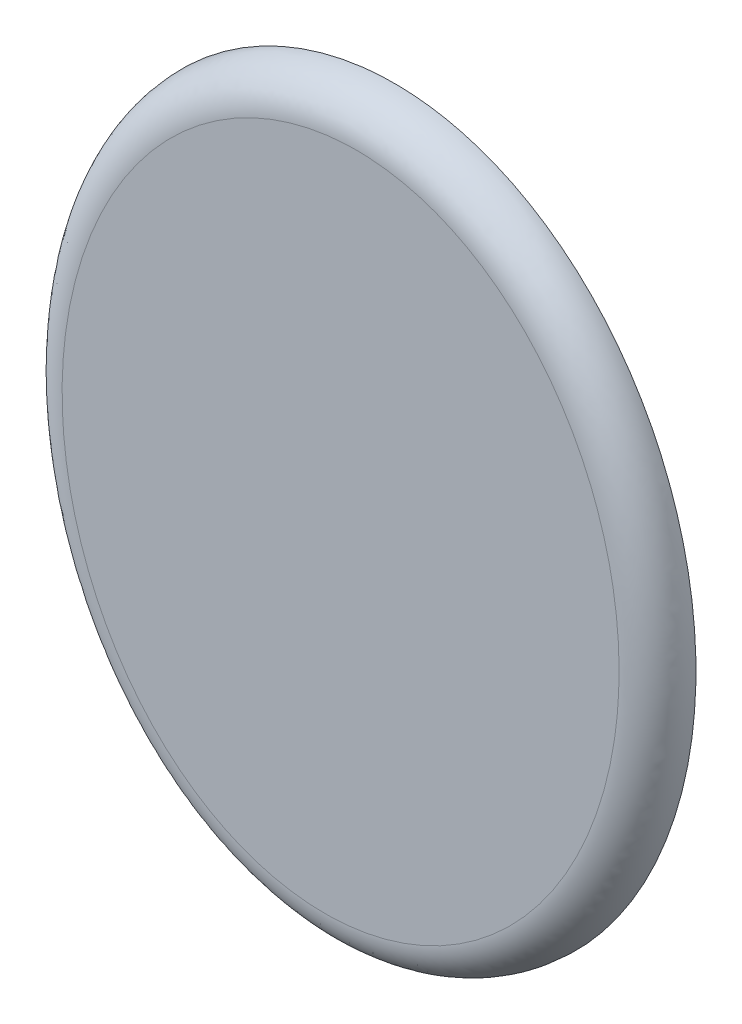
ISO-10303-21;
HEADER;
FILE_DESCRIPTION(('STEP AP214'),'2;1');
FILE_NAME('part.step','',(''),(''),'','','');
FILE_SCHEMA(('AUTOMOTIVE_DESIGN { 1 0 10303 214 1 1 1 1 }'));
ENDSEC;
DATA;
#1=APPLICATION_CONTEXT('core data for automotive mechanical design processes');
#2=APPLICATION_PROTOCOL_DEFINITION('international standard','automotive_design',2000,#1);
#3=PRODUCT_CONTEXT('',#1,'mechanical');
#4=PRODUCT('Part','Part','',(#3));
#5=PRODUCT_RELATED_PRODUCT_CATEGORY('part','',(#4));
#6=PRODUCT_DEFINITION_FORMATION('','',#4);
#7=PRODUCT_DEFINITION_CONTEXT('part definition',#1,'design');
#8=PRODUCT_DEFINITION('design','',#6,#7);
#9=PRODUCT_DEFINITION_SHAPE('','',#8);
#10=(LENGTH_UNIT() NAMED_UNIT(*) SI_UNIT(.MILLI.,.METRE.));
#11=(NAMED_UNIT(*) PLANE_ANGLE_UNIT() SI_UNIT($,.RADIAN.));
#12=(NAMED_UNIT(*) SI_UNIT($,.STERADIAN.) SOLID_ANGLE_UNIT());
#13=UNCERTAINTY_MEASURE_WITH_UNIT(LENGTH_MEASURE(1.E-05),#10,'distance_accuracy_value','');
#14=(GEOMETRIC_REPRESENTATION_CONTEXT(3) GLOBAL_UNCERTAINTY_ASSIGNED_CONTEXT((#13)) GLOBAL_UNIT_ASSIGNED_CONTEXT((#10,
#11,#12)) REPRESENTATION_CONTEXT('',''));
#15=CARTESIAN_POINT('',(0.,0.,0.));
#16=DIRECTION('',(0.,0.,1.));
#17=DIRECTION('',(1.,0.,0.));
#18=AXIS2_PLACEMENT_3D('',#15,#16,#17);
#19=CARTESIAN_POINT('',(0.,0.,2.54));
#20=DIRECTION('',(0.,0.,1.));
#21=DIRECTION('',(1.,0.,0.));
#22=AXIS2_PLACEMENT_3D('',#19,#20,#21);
#23=PLANE('',#22);
#24=CARTESIAN_POINT('',(0.391640197155069,22.353520657387,2.54));
#25=CARTESIAN_POINT('',(0.284177639284905,24.8912463712214,2.54));
#26=CARTESIAN_POINT('',(0.284177639284905,24.8912463712214,0.));
#27=CARTESIAN_POINT('',(0.846379474677865,22.3727809826161,2.54));
#28=CARTESIAN_POINT('',(0.815227843471181,24.9137391399928,2.54));
#29=CARTESIAN_POINT('',(0.815227843471181,24.9137391399928,0.));
#30=CARTESIAN_POINT('',(1.30195747029851,22.3714955758664,2.54));
#31=CARTESIAN_POINT('',(1.34791345861704,24.9122586019739,2.54));
#32=CARTESIAN_POINT('',(1.34791345861704,24.9122586019739,0.));
#33=CARTESIAN_POINT('',(2.21107770155789,22.3273327193164,2.54));
#34=CARTESIAN_POINT('',(2.41157310757733,24.8605879934345,2.54));
#35=CARTESIAN_POINT('',(2.41157310757733,24.8605879934345,0.));
#36=CARTESIAN_POINT('',(2.66462015157246,22.2844597577711,2.54));
#37=CARTESIAN_POINT('',(2.94254731988724,24.8104031792269,2.54));
#38=CARTESIAN_POINT('',(2.94254731988724,24.8104031792269,0.));
#39=CARTESIAN_POINT('',(3.56569066038427,22.157331481397,2.54));
#40=CARTESIAN_POINT('',(3.99743304121653,24.6615738548264,2.54));
#41=CARTESIAN_POINT('',(3.99743304121653,24.6615738548264,0.));
#42=CARTESIAN_POINT('',(4.01322084331342,22.0730911988978,2.54));
#43=CARTESIAN_POINT('',(4.52134704481903,24.5629469478377,2.54));
#44=CARTESIAN_POINT('',(4.52134704481903,24.5629469478377,0.));
#45=CARTESIAN_POINT('',(4.89871978981839,21.8641356197771,2.54));
#46=CARTESIAN_POINT('',(5.55729447685476,24.3184895181597,2.54));
#47=CARTESIAN_POINT('',(5.55729447685476,24.3184895181597,0.));
#48=CARTESIAN_POINT('',(5.3366887677903,21.7394212317253,2.54));
#49=CARTESIAN_POINT('',(6.06932817170281,24.1726600550819,2.54));
#50=CARTESIAN_POINT('',(6.06932817170281,24.1726600550819,0.));
#51=CARTESIAN_POINT('',(6.1665561264388,21.4621319603144,2.54));
#52=CARTESIAN_POINT('',(7.0383261415553,23.8488831562864,2.54));
#53=CARTESIAN_POINT('',(7.0383261415553,23.8488831562864,0.));
#54=CARTESIAN_POINT('',(6.55941549426075,21.3124189585122,2.54));
#55=CARTESIAN_POINT('',(7.49650633388856,23.6742469805276,2.54));
#56=CARTESIAN_POINT('',(7.49650633388857,23.6742469805276,0.));
#57=CARTESIAN_POINT('',(7.33158315630487,20.9814794043709,2.54));
#58=CARTESIAN_POINT('',(8.39565011517977,23.2888876652429,2.54));
#59=CARTESIAN_POINT('',(8.39565011517977,23.2888876652429,0.));
#60=CARTESIAN_POINT('',(7.71089238782342,20.8002550368588,2.54));
#61=CARTESIAN_POINT('',(8.83661489516698,23.0781670276329,2.54));
#62=CARTESIAN_POINT('',(8.83661489516698,23.0781670276329,0.));
#63=CARTESIAN_POINT('',(8.45383955157926,20.4082622416998,2.54));
#64=CARTESIAN_POINT('',(9.69868988839443,22.6233208039314,2.54));
#65=CARTESIAN_POINT('',(9.69868988839443,22.6233208039314,0.));
#66=CARTESIAN_POINT('',(8.81747929096305,20.1974972329321,2.54));
#67=CARTESIAN_POINT('',(10.119802391707,22.379199083584,2.54));
#68=CARTESIAN_POINT('',(10.119802391707,22.379199083584,0.));
#69=CARTESIAN_POINT('',(9.5275296036619,19.7484871027649,2.54));
#70=CARTESIAN_POINT('',(10.9403318292393,21.8603262690566,2.54));
#71=CARTESIAN_POINT('',(10.9403318292393,21.8603262690566,0.));
#72=CARTESIAN_POINT('',(9.87393354508376,19.51023151895,2.54));
#73=CARTESIAN_POINT('',(11.339740417712,21.585563514795,2.54));
#74=CARTESIAN_POINT('',(11.339740417712,21.585563514795,0.));
#75=CARTESIAN_POINT('',(10.567424713038,18.9940914425591,2.54));
#76=CARTESIAN_POINT('',(12.137541389846,20.9917904492521,2.54));
#77=CARTESIAN_POINT('',(12.137541389846,20.9917904492521,0.));
#78=CARTESIAN_POINT('',(10.9134017500032,18.7147147184357,2.54));
#79=CARTESIAN_POINT('',(12.5345497845532,20.6711429915601,2.54));
#80=CARTESIAN_POINT('',(12.5345497845532,20.6711429915601,0.));
#81=CARTESIAN_POINT('',(11.5832146844287,18.1304938228064,2.54));
#82=CARTESIAN_POINT('',(13.3012888235293,20.0023804892595,2.54));
#83=CARTESIAN_POINT('',(13.3012888235293,20.0023804892595,0.));
#84=CARTESIAN_POINT('',(11.9070425373774,17.8256404866575,2.54));
#85=CARTESIAN_POINT('',(13.6710095608243,19.6542555627666,2.54));
#86=CARTESIAN_POINT('',(13.6710095608243,19.6542555627666,0.));
#87=CARTESIAN_POINT('',(12.8438093304033,16.8769088843263,2.54));
#88=CARTESIAN_POINT('',(14.7379455561792,18.5737009540554,2.54));
#89=CARTESIAN_POINT('',(14.7379455561792,18.5737009540554,0.));
#90=CARTESIAN_POINT('',(13.422357173862,16.1986132115718,2.54));
#91=CARTESIAN_POINT('',(15.39330877465,17.8048081550136,2.54));
#92=CARTESIAN_POINT('',(15.39330877465,17.8048081550136,0.));
#93=CARTESIAN_POINT('',(14.5617836366818,14.6651328560788,2.54));
#94=CARTESIAN_POINT('',(16.6785872063486,16.0750539029568,2.54));
#95=CARTESIAN_POINT('',(16.6785872063486,16.0750539029568,0.));
#96=CARTESIAN_POINT('',(15.1073018675721,13.7986352866231,2.54));
#97=CARTESIAN_POINT('',(17.2902964455484,15.1026367483074,2.54));
#98=CARTESIAN_POINT('',(17.2902964455484,15.1026367483074,0.));
#99=CARTESIAN_POINT('',(16.0712886609084,11.9977376925059,2.54));
#100=CARTESIAN_POINT('',(18.367080885641,13.0909989967687,2.54));
#101=CARTESIAN_POINT('',(18.367080885641,13.0909989967687,0.));
#102=CARTESIAN_POINT('',(16.489680844033,11.0632972628485,2.54));
#103=CARTESIAN_POINT('',(18.8320679399781,12.0517386919722,2.54));
#104=CARTESIAN_POINT('',(18.8320679399781,12.0517386919722,0.));
#105=CARTESIAN_POINT('',(17.267121593467,8.97138401549319,2.54));
#106=CARTESIAN_POINT('',(19.693618263704,9.73353407481541,2.54));
#107=CARTESIAN_POINT('',(19.693618263704,9.73353407481541,0.));
#108=CARTESIAN_POINT('',(17.6010002594183,7.80455825210883,2.54));
#109=CARTESIAN_POINT('',(20.0617528432848,8.44573050640986,2.54));
#110=CARTESIAN_POINT('',(20.0617528432848,8.44573050640986,0.));
#111=CARTESIAN_POINT('',(18.0987366580579,5.43530738129285,2.54));
#112=CARTESIAN_POINT('',(20.6094927913668,5.83840571361696,2.54));
#113=CARTESIAN_POINT('',(20.6094927913668,5.83840571361696,0.));
#114=CARTESIAN_POINT('',(18.2624952530707,4.23286193572752,2.54));
#115=CARTESIAN_POINT('',(20.7889882308911,4.51886645292546,2.54));
#116=CARTESIAN_POINT('',(20.7889882308911,4.51886645292546,0.));
#117=CARTESIAN_POINT('',(18.4384725245585,1.61838347496086,2.54));
#118=CARTESIAN_POINT('',(20.9817877668304,1.65457713463331,2.54));
#119=CARTESIAN_POINT('',(20.9817877668304,1.65457713463331,0.));
#120=CARTESIAN_POINT('',(18.4213941869948,0.204355142710669,2.54));
#121=CARTESIAN_POINT('',(20.9629648946311,0.108423351618026,2.54));
#122=CARTESIAN_POINT('',(20.9629648946311,0.108423351618026,0.));
#123=CARTESIAN_POINT('',(18.1697916399954,-2.6057095879929,2.54));
#124=CARTESIAN_POINT('',(20.6879759626174,-2.96285509598669,2.54));
#125=CARTESIAN_POINT('',(20.6879759626174,-2.96285509598669,0.));
#126=CARTESIAN_POINT('',(17.9350841540455,-4.00172981607571,2.54));
#127=CARTESIAN_POINT('',(20.4316098557586,-4.48796093623728,2.54));
#128=CARTESIAN_POINT('',(20.4316098557586,-4.48796093623727,0.));
#129=CARTESIAN_POINT('',(17.4089714730622,-6.11278152929581,2.54));
#130=CARTESIAN_POINT('',(19.8562612908344,-6.79649857089184,2.54));
#131=CARTESIAN_POINT('',(19.8562612908344,-6.79649857089184,0.));
#132=CARTESIAN_POINT('',(17.1925936468142,-6.84725214258196,2.54));
#133=CARTESIAN_POINT('',(19.6195437024275,-7.60012254220796,2.54));
#134=CARTESIAN_POINT('',(19.6195437024275,-7.60012254220796,0.));
#135=CARTESIAN_POINT('',(16.6974744942983,-8.29520270451191,2.54));
#136=CARTESIAN_POINT('',(19.0772844774508,-9.18594355197769,2.54));
#137=CARTESIAN_POINT('',(19.0772844774507,-9.18594355197769,0.));
#138=CARTESIAN_POINT('',(16.4187247824864,-9.00867981609144,2.54));
#139=CARTESIAN_POINT('',(18.7717335865988,-9.96813769342652,2.54));
#140=CARTESIAN_POINT('',(18.7717335865987,-9.96813769342652,0.));
#141=CARTESIAN_POINT('',(15.7995106255763,-10.4078399436349,2.54));
#142=CARTESIAN_POINT('',(18.0919134357411,-11.5042397792471,2.54));
#143=CARTESIAN_POINT('',(18.0919134357411,-11.5042397792471,0.));
#144=CARTESIAN_POINT('',(15.459082007902,-11.0935388136911,2.54));
#145=CARTESIAN_POINT('',(17.717684067379,-12.2581638396086,2.54));
#146=CARTESIAN_POINT('',(17.7176840673791,-12.2581638396086,0.));
#147=CARTESIAN_POINT('',(14.7168806220005,-12.4308667453243,2.54));
#148=CARTESIAN_POINT('',(16.9000888928045,-13.7313423237128,2.54));
#149=CARTESIAN_POINT('',(16.9000888928045,-13.7313423237128,0.));
#150=CARTESIAN_POINT('',(14.3151230153396,-13.0825041741642,2.54));
#151=CARTESIAN_POINT('',(16.4567401734926,-14.4506052586102,2.54));
#152=CARTESIAN_POINT('',(16.4567401734926,-14.4506052586102,0.));
#153=CARTESIAN_POINT('',(13.5457924395887,-14.205845575938,2.54));
#154=CARTESIAN_POINT('',(15.6055414390909,-15.6934830661455,2.54));
#155=CARTESIAN_POINT('',(15.6055414390909,-15.6934830661455,0.));
#156=CARTESIAN_POINT('',(13.1900381936044,-14.6856746429925,2.54));
#157=CARTESIAN_POINT('',(15.2112214642633,-16.2254175669651,2.54));
#158=CARTESIAN_POINT('',(15.2112214642633,-16.2254175669651,0.));
#159=CARTESIAN_POINT('',(12.4420966022632,-15.6160987591055,2.54));
#160=CARTESIAN_POINT('',(14.3802512867556,-17.2591286760381,2.54));
#161=CARTESIAN_POINT('',(14.3802512867556,-17.2591286760381,0.));
#162=CARTESIAN_POINT('',(12.0499122157169,-16.0666961772822,2.54));
#163=CARTESIAN_POINT('',(13.9436045216793,-17.7609077280371,2.54));
#164=CARTESIAN_POINT('',(13.9436045216793,-17.7609077280371,0.));
#165=CARTESIAN_POINT('',(11.2303903532335,-16.9338036527581,2.54));
#166=CARTESIAN_POINT('',(13.0287272934503,-18.7289072284042,2.54));
#167=CARTESIAN_POINT('',(13.0287272934503,-18.7289072284042,0.));
#168=CARTESIAN_POINT('',(10.8030931055884,-17.3503516575552,2.54));
#169=CARTESIAN_POINT('',(12.5505443827705,-19.1951672215908,2.54));
#170=CARTESIAN_POINT('',(12.5505443827705,-19.1951672215908,0.));
#171=CARTESIAN_POINT('',(9.9142462941174,-18.1450979814349,2.54));
#172=CARTESIAN_POINT('',(11.552870343445,-20.0872196870253,2.54));
#173=CARTESIAN_POINT('',(11.552870343445,-20.0872196870253,0.));
#174=CARTESIAN_POINT('',(9.45270501542419,-18.5233055246947,2.54));
#175=CARTESIAN_POINT('',(11.0333892044913,-20.5130218912958,2.54));
#176=CARTESIAN_POINT('',(11.0333892044913,-20.5130218912958,0.));
#177=CARTESIAN_POINT('',(8.57839518515418,-19.175660658582,2.54));
#178=CARTESIAN_POINT('',(10.0461142702822,-21.2496629755941,2.54));
#179=CARTESIAN_POINT('',(10.0461142702822,-21.2496629755941,0.));
#180=CARTESIAN_POINT('',(8.17066360099923,-19.4565705569593,2.54));
#181=CARTESIAN_POINT('',(9.58453483459261,-21.5677427490576,2.54));
#182=CARTESIAN_POINT('',(9.58453483459261,-21.5677427490576,0.));
#183=CARTESIAN_POINT('',(7.33447206578364,-19.9852115955385,2.54));
#184=CARTESIAN_POINT('',(8.63523844073702,-22.1678888019102,2.54));
#185=CARTESIAN_POINT('',(8.63523844073702,-22.1678888019102,0.));
#186=CARTESIAN_POINT('',(6.9060237922958,-20.2329611374949,2.54));
#187=CARTESIAN_POINT('',(8.14753619113725,-22.4499750511783,2.54));
#188=CARTESIAN_POINT('',(8.14753619113725,-22.4499750511783,0.));
#189=CARTESIAN_POINT('',(6.02977197421466,-20.6924093820414,2.54));
#190=CARTESIAN_POINT('',(7.14722458354756,-22.9744713835053,2.54));
#191=CARTESIAN_POINT('',(7.14722458354756,-22.9744713835053,0.));
#192=CARTESIAN_POINT('',(5.58195478606403,-20.9040821358383,2.54));
#193=CARTESIAN_POINT('',(6.63459763585286,-23.2168529034871,2.54));
#194=CARTESIAN_POINT('',(6.63459763585286,-23.2168529034871,0.));
#195=CARTESIAN_POINT('',(4.66966949681388,-21.2879601059054,2.54));
#196=CARTESIAN_POINT('',(5.58731258201675,-23.6575363282305,2.54));
#197=CARTESIAN_POINT('',(5.58731258201675,-23.6575363282305,0.));
#198=CARTESIAN_POINT('',(4.20520186037581,-21.4601664225692,2.54));
#199=CARTESIAN_POINT('',(5.05265509061615,-23.8558394619704,2.54));
#200=CARTESIAN_POINT('',(5.05265509061615,-23.8558394619704,0.));
#201=CARTESIAN_POINT('',(3.25875317221698,-21.7633082278554,2.54));
#202=CARTESIAN_POINT('',(3.960266898935,-24.2057238299958,2.54));
#203=CARTESIAN_POINT('',(3.960266898935,-24.2057238299958,0.));
#204=CARTESIAN_POINT('',(2.77666020843539,-21.893895793036,2.54));
#205=CARTESIAN_POINT('',(3.4023836236573,-24.3569109641507,2.54));
#206=CARTESIAN_POINT('',(3.4023836236573,-24.3569109641507,0.));
#207=CARTESIAN_POINT('',(1.80216595778287,-22.1091237985066,2.54));
#208=CARTESIAN_POINT('',(2.27201986367654,-24.6065632771048,2.54));
#209=CARTESIAN_POINT('',(2.27201986367654,-24.6065632771048,0.));
#210=CARTESIAN_POINT('',(1.30976266388863,-22.1937552049057,2.54));
#211=CARTESIAN_POINT('',(1.69953653208832,-24.7050180899282,2.54));
#212=CARTESIAN_POINT('',(1.69953653208832,-24.7050180899282,0.));
#213=CARTESIAN_POINT('',(0.320588917871295,-22.3146517261667,2.54));
#214=CARTESIAN_POINT('',(0.547341550102333,-24.8458381610729,2.54));
#215=CARTESIAN_POINT('',(0.547341550102333,-24.8458381610729,0.));
#216=CARTESIAN_POINT('',(-0.176163394645175,-22.3510651202879,2.54));
#217=CARTESIAN_POINT('',(-0.032342380654814,-24.8883753733572,2.54));
#218=CARTESIAN_POINT('',(-0.0323423806548137,-24.8883753733572,0.));
#219=CARTESIAN_POINT('',(-1.17056143836497,-22.3745756827744,2.54));
#220=CARTESIAN_POINT('',(-1.19417258112527,-24.9158429479039,2.54));
#221=CARTESIAN_POINT('',(-1.19417258112527,-24.9158429479039,0.));
#222=CARTESIAN_POINT('',(-1.66820603285543,-22.3617152636274,2.54));
#223=CARTESIAN_POINT('',(-1.77631630256362,-24.900822852679,2.54));
#224=CARTESIAN_POINT('',(-1.77631630256362,-24.9008228526789,0.));
#225=CARTESIAN_POINT('',(-2.31639472745618,-22.3124510853269,2.54));
#226=CARTESIAN_POINT('',(-2.53492977398452,-24.843167683844,2.54));
#227=CARTESIAN_POINT('',(-2.53492977398452,-24.843167683844,0.));
#228=CARTESIAN_POINT('',(-2.46885848707325,-22.2984940544918,2.54));
#229=CARTESIAN_POINT('',(-2.71339359946976,-24.8268304792632,2.54));
#230=CARTESIAN_POINT('',(-2.71339359946976,-24.8268304792632,0.));
#231=CARTESIAN_POINT('',(-2.77328341481524,-22.2658875106034,2.54));
#232=CARTESIAN_POINT('',(-3.06975911552851,-24.788660597623,2.54));
#233=CARTESIAN_POINT('',(-3.06975911552851,-24.788660597623,0.));
#234=CARTESIAN_POINT('',(-2.92524458936755,-22.2472380577967,2.54));
#235=CARTESIAN_POINT('',(-3.24766081328955,-24.7668279911198,2.54));
#236=CARTESIAN_POINT('',(-3.24766081328955,-24.7668279911198,0.));
#237=CARTESIAN_POINT('',(-3.50882127723457,-22.1664448460176,2.54));
#238=CARTESIAN_POINT('',(-3.93085636653116,-24.6722420008777,2.54));
#239=CARTESIAN_POINT('',(-3.93085636653116,-24.6722420008777,0.));
#240=CARTESIAN_POINT('',(-3.93825945356189,-22.0876148137101,2.54));
#241=CARTESIAN_POINT('',(-4.43360017124716,-24.579949262195,2.54));
#242=CARTESIAN_POINT('',(-4.43360017124716,-24.579949262195,0.));
#243=CARTESIAN_POINT('',(-4.78877354607199,-21.8926258631644,2.54));
#244=CARTESIAN_POINT('',(-5.42870751298194,-24.3518115245675,2.54));
#245=CARTESIAN_POINT('',(-5.42870751298195,-24.3518115245675,0.));
#246=CARTESIAN_POINT('',(-5.20984391987412,-21.7764430255926,2.54));
#247=CARTESIAN_POINT('',(-5.92106418260101,-24.2159386186523,2.54));
#248=CARTESIAN_POINT('',(-5.92106418260101,-24.2159386186523,0.));
#249=CARTESIAN_POINT('',(-6.04132456518352,-21.5077719452138,2.54));
#250=CARTESIAN_POINT('',(-6.89220687552782,-23.9021397739115,2.54));
#251=CARTESIAN_POINT('',(-6.89220687552782,-23.9021397739115,0.));
#252=CARTESIAN_POINT('',(-6.45170777542214,-21.3551999192969,2.54));
#253=CARTESIAN_POINT('',(-7.37095868510686,-23.7241167950075,2.54));
#254=CARTESIAN_POINT('',(-7.37095868510686,-23.7241167950075,0.));
#255=CARTESIAN_POINT('',(-7.25792231859373,-21.0157458491258,2.54));
#256=CARTESIAN_POINT('',(-8.30997867095168,-23.3287460677262,2.54));
#257=CARTESIAN_POINT('',(-8.30997867095167,-23.3287460677262,0.));
#258=CARTESIAN_POINT('',(-7.65375589128512,-20.8288691124823,2.54));
#259=CARTESIAN_POINT('',(-8.77024969314974,-23.1114044027952,2.54));
#260=CARTESIAN_POINT('',(-8.77024969314974,-23.1114044027952,0.));
#261=CARTESIAN_POINT('',(-8.42673454944222,-20.4239338990987,2.54));
#262=CARTESIAN_POINT('',(-9.66729881885594,-22.6414738681765,2.54));
#263=CARTESIAN_POINT('',(-9.66729881885594,-22.6414738681765,0.));
#264=CARTESIAN_POINT('',(-8.80395872743807,-20.2060261059729,2.54));
#265=CARTESIAN_POINT('',(-10.1041771724682,-22.3890554629329,2.54));
#266=CARTESIAN_POINT('',(-10.1041771724682,-22.3890554629329,0.));
#267=CARTESIAN_POINT('',(-9.53976977384839,-19.7407678751502,2.54));
#268=CARTESIAN_POINT('',(-10.9544774336248,-21.8514055110485,2.54));
#269=CARTESIAN_POINT('',(-10.9544774336248,-21.8514055110485,0.));
#270=CARTESIAN_POINT('',(-9.89835603068892,-19.4934164721829,2.54));
#271=CARTESIAN_POINT('',(-11.3678985714983,-21.5661728886466,2.54));
#272=CARTESIAN_POINT('',(-11.3678985714983,-21.5661728886466,0.));
#273=CARTESIAN_POINT('',(-10.5951467029795,-18.9719505785291,2.54));
#274=CARTESIAN_POINT('',(-12.1693641748357,-20.9663706993105,2.54));
#275=CARTESIAN_POINT('',(-12.1693641748357,-20.9663706993105,0.));
#276=CARTESIAN_POINT('',(-10.9333628449719,-18.6978517284661,2.54));
#277=CARTESIAN_POINT('',(-12.5574232517456,-20.65181828195,2.54));
#278=CARTESIAN_POINT('',(-12.5574232517456,-20.65181828195,0.));
#279=CARTESIAN_POINT('',(-11.5886074001477,-18.1252207127666,2.54));
#280=CARTESIAN_POINT('',(-13.3074370289785,-19.9963667342634,2.54));
#281=CARTESIAN_POINT('',(-13.3074370289785,-19.9963667342634,0.));
#282=CARTESIAN_POINT('',(-11.9056276751339,-17.8266792591008,2.54));
#283=CARTESIAN_POINT('',(-13.6693817067963,-19.6554575913205,2.54));
#284=CARTESIAN_POINT('',(-13.6693817067963,-19.6554575913205,0.));
#285=CARTESIAN_POINT('',(-12.5441807919211,-17.1807820855722,2.54));
#286=CARTESIAN_POINT('',(-14.396699232919,-18.9197763535442,2.54));
#287=CARTESIAN_POINT('',(-14.396699232919,-18.9197763535442,0.));
#288=CARTESIAN_POINT('',(-12.8637050492393,-16.831439287222,2.54));
#289=CARTESIAN_POINT('',(-14.759628831255,-18.5228987013851,2.54));
#290=CARTESIAN_POINT('',(-14.759628831255,-18.5228987013852,0.));
#291=CARTESIAN_POINT('',(-13.4759795820412,-16.1099564861472,2.54));
#292=CARTESIAN_POINT('',(-15.453362341706,-17.7054251871128,2.54));
#293=CARTESIAN_POINT('',(-15.453362341706,-17.7054251871128,0.));
#294=CARTESIAN_POINT('',(-13.7687201231513,-15.7378082763462,2.54));
#295=CARTESIAN_POINT('',(-15.7841545763784,-17.2848207907377,2.54));
#296=CARTESIAN_POINT('',(-15.7841545763784,-17.2848207907377,0.));
#297=CARTESIAN_POINT('',(-14.6061268901223,-14.5914913813013,2.54));
#298=CARTESIAN_POINT('',(-16.728219754719,-15.9925148982169,2.54));
#299=CARTESIAN_POINT('',(-16.728219754719,-15.9925148982169,0.));
#300=CARTESIAN_POINT('',(-15.1101724876582,-13.7872511487945,2.54));
#301=CARTESIAN_POINT('',(-17.2934019240357,-15.0900935646777,2.54));
#302=CARTESIAN_POINT('',(-17.2934019240357,-15.0900935646777,0.));
#303=CARTESIAN_POINT('',(-16.0873807904737,-11.9743350542776,2.54));
#304=CARTESIAN_POINT('',(-18.3851680726294,-13.0646657518371,2.54));
#305=CARTESIAN_POINT('',(-18.3851680726294,-13.0646657518371,0.));
#306=CARTESIAN_POINT('',(-16.5396925417036,-10.9545165515903,2.54));
#307=CARTESIAN_POINT('',(-18.8876772016246,-11.9306981460108,2.54));
#308=CARTESIAN_POINT('',(-18.8876772016246,-11.9306981460108,0.));
#309=CARTESIAN_POINT('',(-17.2963976068262,-8.86141442451057,2.54));
#310=CARTESIAN_POINT('',(-19.7258346205139,-9.61226558417171,2.54));
#311=CARTESIAN_POINT('',(-19.7258346205139,-9.61226558417171,0.));
#312=CARTESIAN_POINT('',(-17.6006972864052,-7.78809742832458,2.54));
#313=CARTESIAN_POINT('',(-20.061377288389,-8.4277691769455,2.54));
#314=CARTESIAN_POINT('',(-20.061377288389,-8.4277691769455,0.));
#315=CARTESIAN_POINT('',(-18.1075305618271,-5.41323805516549,2.54));
#316=CARTESIAN_POINT('',(-20.6192166996477,-5.8139486309914,2.54));
#317=CARTESIAN_POINT('',(-20.6192166996477,-5.8139486309914,0.));
#318=CARTESIAN_POINT('',(-18.2815834977346,-4.10561945343507,2.54));
#319=CARTESIAN_POINT('',(-20.8099215046607,-4.37919585161958,2.54));
#320=CARTESIAN_POINT('',(-20.8099215046607,-4.37919585161958,0.));
#321=CARTESIAN_POINT('',(-18.4353201195336,-1.47841164549498,2.54));
#322=CARTESIAN_POINT('',(-20.9783090925781,-1.50155506873648,2.54));
#323=CARTESIAN_POINT('',(-20.9783090925781,-1.50155506873648,0.));
#324=CARTESIAN_POINT('',(-18.4148944847277,-0.158816123178907,2.54));
#325=CARTESIAN_POINT('',(-20.9558720637691,-0.0586629453747136,2.54));
#326=CARTESIAN_POINT('',(-20.9558720637691,-0.0586629453747147,0.));
#327=CARTESIAN_POINT('',(-18.2349133242543,1.89292000776167,2.54));
#328=CARTESIAN_POINT('',(-20.7591445261204,2.18381348748582,2.54));
#329=CARTESIAN_POINT('',(-20.7591445261204,2.18381348748582,0.));
#330=CARTESIAN_POINT('',(-18.1396340328672,2.63129655098832,2.54));
#331=CARTESIAN_POINT('',(-20.6550354433186,2.99063503370059,2.54));
#332=CARTESIAN_POINT('',(-20.6550354433186,2.99063503370059,0.));
#333=CARTESIAN_POINT('',(-17.8892074234737,4.09813459218018,2.54));
#334=CARTESIAN_POINT('',(-20.3813554377956,4.59369303925713,2.54));
#335=CARTESIAN_POINT('',(-20.3813554377956,4.59369303925713,0.));
#336=CARTESIAN_POINT('',(-17.734048122784,4.82659407540159,2.54));
#337=CARTESIAN_POINT('',(-20.2117714127772,5.38992734695874,2.54));
#338=CARTESIAN_POINT('',(-20.2117714127772,5.38992734695874,0.));
#339=CARTESIAN_POINT('',(-17.364248465397,6.26891288708299,2.54));
#340=CARTESIAN_POINT('',(-19.8073401486779,6.96731651427694,2.54));
#341=CARTESIAN_POINT('',(-19.8073401486779,6.96731651427694,0.));
#342=CARTESIAN_POINT('',(-17.1495566682175,6.98275901310633,2.54));
#343=CARTESIAN_POINT('',(-19.572436468087,7.74845770509463,2.54));
#344=CARTESIAN_POINT('',(-19.572436468087,7.74845770509463,0.));
#345=CARTESIAN_POINT('',(-16.6611832792812,8.38997310015404,2.54));
#346=CARTESIAN_POINT('',(-19.0375055678263,9.28982516227427,2.54));
#347=CARTESIAN_POINT('',(-19.0375055678263,9.28982516227427,0.));
#348=CARTESIAN_POINT('',(-16.3875056483948,9.08334243263238,2.54));
#349=CARTESIAN_POINT('',(-18.7374827208675,10.050052829106,2.54));
#350=CARTESIAN_POINT('',(-18.7374827208675,10.050052829106,0.));
#351=CARTESIAN_POINT('',(-15.7745158935627,10.4597483948546,2.54));
#352=CARTESIAN_POINT('',(-18.0644458773225,11.5612897753306,2.54));
#353=CARTESIAN_POINT('',(-18.0644458773225,11.5612897753306,0.));
#354=CARTESIAN_POINT('',(-15.4338346967597,11.1421771869337,2.54));
#355=CARTESIAN_POINT('',(-17.6899070484648,12.3116813204424,2.54));
#356=CARTESIAN_POINT('',(-17.6899070484648,12.3116813204424,0.));
#357=CARTESIAN_POINT('',(-14.6914874926118,12.4732526388516,2.54));
#358=CARTESIAN_POINT('',(-16.8720788588021,13.778099946547,2.54));
#359=CARTESIAN_POINT('',(-16.8720788588021,13.778099946547,0.));
#360=CARTESIAN_POINT('',(-14.2898129550517,13.1218945563636,2.54));
#361=CARTESIAN_POINT('',(-16.4287798813695,14.4941222023642,2.54));
#362=CARTESIAN_POINT('',(-16.4287798813695,14.4941222023642,0.));
#363=CARTESIAN_POINT('',(-13.4269518924759,14.376795467534,2.54));
#364=CARTESIAN_POINT('',(-15.474009044674,15.8826926324693,2.54));
#365=CARTESIAN_POINT('',(-15.474009044674,15.8826926324693,0.));
#366=CARTESIAN_POINT('',(-12.9658675003384,14.9831245066792,2.54));
#367=CARTESIAN_POINT('',(-14.9626541334258,16.5553125096736,2.54));
#368=CARTESIAN_POINT('',(-14.9626541334258,16.5553125096736,0.));
#369=CARTESIAN_POINT('',(-11.9849295444799,16.1461000892605,2.54));
#370=CARTESIAN_POINT('',(-13.8713290846301,17.8491624806267,2.54));
#371=CARTESIAN_POINT('',(-13.8713290846301,17.8491624806267,0.));
#372=CARTESIAN_POINT('',(-11.4651034132467,16.702769608206,2.54));
#373=CARTESIAN_POINT('',(-13.291390969712,18.4704163295824,2.54));
#374=CARTESIAN_POINT('',(-13.291390969712,18.4704163295824,0.));
#375=CARTESIAN_POINT('',(-10.5372678718557,17.5950779477012,2.54));
#376=CARTESIAN_POINT('',(-12.2524392091057,19.4695811927208,2.54));
#377=CARTESIAN_POINT('',(-12.2524392091057,19.4695811927208,0.));
#378=CARTESIAN_POINT('',(-10.1439550868044,17.9460894324179,2.54));
#379=CARTESIAN_POINT('',(-11.8109957958384,19.8636250729979,2.54));
#380=CARTESIAN_POINT('',(-11.8109957958384,19.8636250729979,0.));
#381=CARTESIAN_POINT('',(-9.33119492240008,18.6163589358321,2.54));
#382=CARTESIAN_POINT('',(-10.8962706929817,20.6179843103494,2.54));
#383=CARTESIAN_POINT('',(-10.8962706929817,20.6179843103494,0.));
#384=CARTESIAN_POINT('',(-8.91175419507062,18.9356249834291,2.54));
#385=CARTESIAN_POINT('',(-10.4229971047463,20.9783081943558,2.54));
#386=CARTESIAN_POINT('',(-10.4229971047463,20.9783081943558,0.));
#387=CARTESIAN_POINT('',(-8.04812428374408,19.5388055506054,2.54));
#388=CARTESIAN_POINT('',(-9.44566559982944,21.6609001642403,2.54));
#389=CARTESIAN_POINT('',(-9.44566559982944,21.6609001642403,0.));
#390=CARTESIAN_POINT('',(-7.6039350632351,19.8227200180278,2.54));
#391=CARTESIAN_POINT('',(-8.94160763773121,21.9831681939717,2.54));
#392=CARTESIAN_POINT('',(-8.94160763773121,21.9831681939717,0.));
#393=CARTESIAN_POINT('',(-6.6929868596965,20.3512471641564,2.54));
#394=CARTESIAN_POINT('',(-7.90472316572036,22.5847623885123,2.54));
#395=CARTESIAN_POINT('',(-7.90472316572036,22.5847623885123,0.));
#396=CARTESIAN_POINT('',(-6.22623939687824,20.5958796334572,2.54));
#397=CARTESIAN_POINT('',(-7.37191132417591,22.8641101738132,2.54));
#398=CARTESIAN_POINT('',(-7.37191132417591,22.8641101738132,0.));
#399=CARTESIAN_POINT('',(-5.26829355059677,21.0441248529992,2.54));
#400=CARTESIAN_POINT('',(-6.27502120314035,23.3773697781357,2.54));
#401=CARTESIAN_POINT('',(-6.27502120314035,23.3773697781357,0.));
#402=CARTESIAN_POINT('',(-4.77691442104986,21.2473528581377,2.54));
#403=CARTESIAN_POINT('',(-5.71070671609927,23.6108547652276,2.54));
#404=CARTESIAN_POINT('',(-5.71070671609927,23.6108547652276,0.));
#405=CARTESIAN_POINT('',(-3.77697293802004,21.6061621084075,2.54));
#406=CARTESIAN_POINT('',(-4.55893756512201,24.0241430449489,2.54));
#407=CARTESIAN_POINT('',(-4.55893756512201,24.0241430449489,0.));
#408=CARTESIAN_POINT('',(-3.26841029712669,21.7617425561501,2.54));
#409=CARTESIAN_POINT('',(-3.9714825141108,24.2039454391913,2.54));
#410=CARTESIAN_POINT('',(-3.9714825141108,24.2039454391913,0.));
#411=CARTESIAN_POINT('',(-2.238750325311,22.0216237201512,2.54));
#412=CARTESIAN_POINT('',(-2.77893480804242,24.5049373369572,2.54));
#413=CARTESIAN_POINT('',(-2.77893480804242,24.5049373369572,0.));
#414=CARTESIAN_POINT('',(-1.71766406895903,22.1259681121876,2.54));
#415=CARTESIAN_POINT('',(-2.1738576426074,24.6261767605903,2.54));
#416=CARTESIAN_POINT('',(-2.17385764260739,24.6261767605903,0.));
#417=CARTESIAN_POINT('',(-0.667550806089579,22.280684001716,2.54));
#418=CARTESIAN_POINT('',(-0.951867243563171,24.8062136002762,2.54));
#419=CARTESIAN_POINT('',(-0.951867243563171,24.8062136002762,0.));
#420=CARTESIAN_POINT('',(-0.138525316511322,22.3310656799457,2.54));
#421=CARTESIAN_POINT('',(-0.334956264913518,24.8650227945503,2.54));
#422=CARTESIAN_POINT('',(-0.334956264913518,24.8650227945503,0.));
#423=CARTESIAN_POINT('',(0.391640197155069,22.353520657387,2.54));
#424=CARTESIAN_POINT('',(0.284177639284905,24.8912463712214,2.54));
#425=CARTESIAN_POINT('',(0.284177639284905,24.8912463712214,0.));
#426=(BOUNDED_SURFACE() B_SPLINE_SURFACE(3,2,((#24,#25,#26),(#27,#28,#29),(#30,#31,#32),(#33,
#34,#35),(#36,#37,#38),(#39,#40,#41),(#42,#43,#44),(#45,#46,#47),(#48,#49,#50),(#51,#52,#53),
(#54,#55,#56),(#57,#58,#59),(#60,#61,#62),(#63,#64,#65),(#66,#67,#68),(#69,#70,#71),(#72,#73,
#74),(#75,#76,#77),(#78,#79,#80),(#81,#82,#83),(#84,#85,#86),(#87,#88,#89),(#90,#91,#92),(#93,
#94,#95),(#96,#97,#98),(#99,#100,#101),(#102,#103,#104),(#105,#106,#107),(#108,#109,#110),(#111,
#112,#113),(#114,#115,#116),(#117,#118,#119),(#120,#121,#122),(#123,#124,#125),(#126,#127,#128),
(#129,#130,#131),(#132,#133,#134),(#135,#136,#137),(#138,#139,#140),(#141,#142,#143),(#144,#145,
#146),(#147,#148,#149),(#150,#151,#152),(#153,#154,#155),(#156,#157,#158),(#159,#160,#161),
(#162,#163,#164),(#165,#166,#167),(#168,#169,#170),(#171,#172,#173),(#174,#175,#176),(#177,#178,
#179),(#180,#181,#182),(#183,#184,#185),(#186,#187,#188),(#189,#190,#191),(#192,#193,#194),
(#195,#196,#197),(#198,#199,#200),(#201,#202,#203),(#204,#205,#206),(#207,#208,#209),(#210,#211,
#212),(#213,#214,#215),(#216,#217,#218),(#219,#220,#221),(#222,#223,#224),(#225,#226,#227),
(#228,#229,#230),(#231,#232,#233),(#234,#235,#236),(#237,#238,#239),(#240,#241,#242),(#243,#244,
#245),(#246,#247,#248),(#249,#250,#251),(#252,#253,#254),(#255,#256,#257),(#258,#259,#260),
(#261,#262,#263),(#264,#265,#266),(#267,#268,#269),(#270,#271,#272),(#273,#274,#275),(#276,#277,
#278),(#279,#280,#281),(#282,#283,#284),(#285,#286,#287),(#288,#289,#290),(#291,#292,#293),
(#294,#295,#296),(#297,#298,#299),(#300,#301,#302),(#303,#304,#305),(#306,#307,#308),(#309,#310,
#311),(#312,#313,#314),(#315,#316,#317),(#318,#319,#320),(#321,#322,#323),(#324,#325,#326),
(#327,#328,#329),(#330,#331,#332),(#333,#334,#335),(#336,#337,#338),(#339,#340,#341),(#342,#343,
#344),(#345,#346,#347),(#348,#349,#350),(#351,#352,#353),(#354,#355,#356),(#357,#358,#359),
(#360,#361,#362),(#363,#364,#365),(#366,#367,#368),(#369,#370,#371),(#372,#373,#374),(#375,#376,
#377),(#378,#379,#380),(#381,#382,#383),(#384,#385,#386),(#387,#388,#389),(#390,#391,#392),
(#393,#394,#395),(#396,#397,#398),(#399,#400,#401),(#402,#403,#404),(#405,#406,#407),(#408,#409,
#410),(#411,#412,#413),(#414,#415,#416),(#417,#418,#419),(#420,#421,#422),(#423,#424,#425)),
.UNSPECIFIED.,.T.,.F.,.F.) B_SPLINE_SURFACE_WITH_KNOTS((4,2,2,2,2,2,2,2,2,2,2,2,2,2,2,2,2,2,2,2,
2,2,2,2,2,2,2,2,2,2,2,2,2,2,2,2,2,2,2,2,2,2,2,2,2,2,2,2,2,2,2,2,2,2,2,2,2,2,2,2,2,2,2,2,2,2,4),
(3,3),(0.,1.36490809721344,2.72966890579595,4.09393414518766,5.45816876143122,6.71801926436186,
7.97778245090707,9.23739995926155,10.4974984463765,11.8301870118384,13.1633570630906,
15.8284852405882,18.8890786262796,21.951507244797,25.5786505300172,29.2079063536439,
33.4330675847454,37.6617902727052,39.9564577726099,42.2514339630283,44.5450813198808,
46.8381625637583,48.6284697445402,50.418631645731,52.2067704394195,53.9944780059039,
55.4784441540719,56.9615833566076,58.4457848690236,59.9299449942557,61.4262053283108,
62.9227596852875,64.4147010912209,65.9053585956016,66.3646128873495,66.8238612829694,
68.1318256952278,69.4406293526408,70.7524760182093,72.0641198862135,73.3695989751245,
74.6751208742603,75.9798838900192,77.2851450290327,78.7040064345713,80.1233814847827,
82.9613046657238,86.296001991965,89.6328061551639,93.5750169825479,97.5194439444265,
99.7508185689081,101.982639949024,104.216395829721,106.450001761491,108.735159870631,
111.020637865089,113.302237993219,115.582776979756,117.162846765248,118.742515905329,
120.322187375987,121.901060481062,123.493995726292,125.086957628067,126.67855925421,
128.269860551975),(0.,1.),
.UNSPECIFIED.) GEOMETRIC_REPRESENTATION_ITEM() RATIONAL_B_SPLINE_SURFACE(((1.,0.707106781186548,
1.),(1.,0.707106781186548,1.),(1.,0.707106781186548,1.),(1.,0.707106781186548,1.),(1.,
0.707106781186548,1.),(1.,0.707106781186548,1.),(1.,0.707106781186548,1.),(1.,0.707106781186548,
1.),(1.,0.707106781186548,1.),(1.,0.707106781186548,1.),(1.,0.707106781186548,1.),(1.,
0.707106781186548,1.),(1.,0.707106781186548,1.),(1.,0.707106781186548,1.),(1.,0.707106781186548,
1.),(1.,0.707106781186548,1.),(1.,0.707106781186548,1.),(1.,0.707106781186548,1.),(1.,
0.707106781186548,1.),(1.,0.707106781186548,1.),(1.,0.707106781186548,1.),(1.,0.707106781186548,
1.),(1.,0.707106781186548,1.),(1.,0.707106781186548,1.),(1.,0.707106781186548,1.),(1.,
0.707106781186548,1.),(1.,0.707106781186548,1.),(1.,0.707106781186548,1.),(1.,0.707106781186548,
1.),(1.,0.707106781186548,1.),(1.,0.707106781186548,1.),(1.,0.707106781186548,1.),(1.,
0.707106781186548,1.),(1.,0.707106781186548,1.),(1.,0.707106781186548,1.),(1.,0.707106781186548,
1.),(1.,0.707106781186548,1.),(1.,0.707106781186548,1.),(1.,0.707106781186548,1.),(1.,
0.707106781186548,1.),(1.,0.707106781186548,1.),(1.,0.707106781186548,1.),(1.,0.707106781186548,
1.),(1.,0.707106781186548,1.),(1.,0.707106781186548,1.),(1.,0.707106781186548,1.),(1.,
0.707106781186548,1.),(1.,0.707106781186548,1.),(1.,0.707106781186548,1.),(1.,0.707106781186548,
1.),(1.,0.707106781186548,1.),(1.,0.707106781186548,1.),(1.,0.707106781186548,1.),(1.,
0.707106781186548,1.),(1.,0.707106781186548,1.),(1.,0.707106781186548,1.),(1.,0.707106781186548,
1.),(1.,0.707106781186548,1.),(1.,0.707106781186548,1.),(1.,0.707106781186548,1.),(1.,
0.707106781186548,1.),(1.,0.707106781186548,1.),(1.,0.707106781186548,1.),(1.,0.707106781186548,
1.),(1.,0.707106781186548,1.),(1.,0.707106781186548,1.),(1.,0.707106781186548,1.),(1.,
0.707106781186548,1.),(1.,0.707106781186548,1.),(1.,0.707106781186548,1.),(1.,0.707106781186548,
1.),(1.,0.707106781186548,1.),(1.,0.707106781186548,1.),(1.,0.707106781186548,1.),(1.,
0.707106781186548,1.),(1.,0.707106781186548,1.),(1.,0.707106781186548,1.),(1.,0.707106781186548,
1.),(1.,0.707106781186548,1.),(1.,0.707106781186548,1.),(1.,0.707106781186548,1.),(1.,
0.707106781186548,1.),(1.,0.707106781186548,1.),(1.,0.707106781186548,1.),(1.,0.707106781186548,
1.),(1.,0.707106781186548,1.),(1.,0.707106781186548,1.),(1.,0.707106781186548,1.),(1.,
0.707106781186548,1.),(1.,0.707106781186548,1.),(1.,0.707106781186548,1.),(1.,0.707106781186548,
1.),(1.,0.707106781186548,1.),(1.,0.707106781186548,1.),(1.,0.707106781186548,1.),(1.,
0.707106781186548,1.),(1.,0.707106781186548,1.),(1.,0.707106781186548,1.),(1.,0.707106781186548,
1.),(1.,0.707106781186548,1.),(1.,0.707106781186548,1.),(1.,0.707106781186548,1.),(1.,
0.707106781186548,1.),(1.,0.707106781186548,1.),(1.,0.707106781186548,1.),(1.,0.707106781186548,
1.),(1.,0.707106781186548,1.),(1.,0.707106781186548,1.),(1.,0.707106781186548,1.),(1.,
0.707106781186548,1.),(1.,0.707106781186548,1.),(1.,0.707106781186548,1.),(1.,0.707106781186548,
1.),(1.,0.707106781186548,1.),(1.,0.707106781186548,1.),(1.,0.707106781186548,1.),(1.,
0.707106781186548,1.),(1.,0.707106781186548,1.),(1.,0.707106781186548,1.),(1.,0.707106781186548,
1.),(1.,0.707106781186548,1.),(1.,0.707106781186548,1.),(1.,0.707106781186548,1.),(1.,
0.707106781186548,1.),(1.,0.707106781186548,1.),(1.,0.707106781186548,1.),(1.,0.707106781186548,
1.),(1.,0.707106781186548,1.),(1.,0.707106781186548,1.),(1.,0.707106781186548,1.),(1.,
0.707106781186548,1.),(1.,0.707106781186548,1.),(1.,0.707106781186548,1.),(1.,0.707106781186548,1.))) REPRESENTATION_ITEM('') SURFACE());
#427=CARTESIAN_POINT('',(0.391640197155069,22.353520657387,2.54));
#428=CARTESIAN_POINT('',(-0.138525316511317,22.3310656799457,2.54));
#429=CARTESIAN_POINT('',(-0.667550806089577,22.2806840017161,2.54));
#430=CARTESIAN_POINT('',(-1.71766406895903,22.1259681121876,2.54));
#431=CARTESIAN_POINT('',(-2.238750325311,22.0216237201512,2.54));
#432=CARTESIAN_POINT('',(-3.26841029712669,21.7617425561501,2.54));
#433=CARTESIAN_POINT('',(-3.77697293802003,21.6061621084075,2.54));
#434=CARTESIAN_POINT('',(-4.77691442104986,21.2473528581377,2.54));
#435=CARTESIAN_POINT('',(-5.26829355059677,21.0441248529992,2.54));
#436=CARTESIAN_POINT('',(-6.22623939687824,20.5958796334572,2.54));
#437=CARTESIAN_POINT('',(-6.6929868596965,20.3512471641564,2.54));
#438=CARTESIAN_POINT('',(-7.60393506323509,19.8227200180278,2.54));
#439=CARTESIAN_POINT('',(-8.04812428374408,19.5388055506054,2.54));
#440=CARTESIAN_POINT('',(-8.91175419507062,18.9356249834291,2.54));
#441=CARTESIAN_POINT('',(-9.33119492240009,18.6163589358321,2.54));
#442=CARTESIAN_POINT('',(-10.1439550868044,17.9460894324179,2.54));
#443=CARTESIAN_POINT('',(-10.5372678718557,17.5950779477012,2.54));
#444=CARTESIAN_POINT('',(-11.4651034132467,16.702769608206,2.54));
#445=CARTESIAN_POINT('',(-11.9849295444799,16.1461000892605,2.54));
#446=CARTESIAN_POINT('',(-12.9658675003384,14.9831245066792,2.54));
#447=CARTESIAN_POINT('',(-13.4269518924759,14.376795467534,2.54));
#448=CARTESIAN_POINT('',(-14.2898129550517,13.1218945563636,2.54));
#449=CARTESIAN_POINT('',(-14.6914874926118,12.4732526388516,2.54));
#450=CARTESIAN_POINT('',(-15.4338346967597,11.1421771869337,2.54));
#451=CARTESIAN_POINT('',(-15.7745158935627,10.4597483948546,2.54));
#452=CARTESIAN_POINT('',(-16.3875056483948,9.08334243263239,2.54));
#453=CARTESIAN_POINT('',(-16.6611832792812,8.38997310015404,2.54));
#454=CARTESIAN_POINT('',(-17.1495566682175,6.98275901310633,2.54));
#455=CARTESIAN_POINT('',(-17.364248465397,6.26891288708299,2.54));
#456=CARTESIAN_POINT('',(-17.734048122784,4.82659407540159,2.54));
#457=CARTESIAN_POINT('',(-17.8892074234737,4.09813459218018,2.54));
#458=CARTESIAN_POINT('',(-18.1396340328672,2.63129655098832,2.54));
#459=CARTESIAN_POINT('',(-18.2349133242543,1.89292000776167,2.54));
#460=CARTESIAN_POINT('',(-18.4148944847277,-0.158816123178903,2.54));
#461=CARTESIAN_POINT('',(-18.4353201195336,-1.47841164549498,2.54));
#462=CARTESIAN_POINT('',(-18.2815834977346,-4.10561945343507,2.54));
#463=CARTESIAN_POINT('',(-18.1075305618271,-5.41323805516549,2.54));
#464=CARTESIAN_POINT('',(-17.6006972864052,-7.78809742832458,2.54));
#465=CARTESIAN_POINT('',(-17.2963976068262,-8.86141442451057,2.54));
#466=CARTESIAN_POINT('',(-16.5396925417036,-10.9545165515903,2.54));
#467=CARTESIAN_POINT('',(-16.0873807904736,-11.9743350542776,2.54));
#468=CARTESIAN_POINT('',(-15.1101724876582,-13.7872511487945,2.54));
#469=CARTESIAN_POINT('',(-14.6061268901223,-14.5914913813013,2.54));
#470=CARTESIAN_POINT('',(-13.7687201231513,-15.7378082763462,2.54));
#471=CARTESIAN_POINT('',(-13.4759795820412,-16.1099564861472,2.54));
#472=CARTESIAN_POINT('',(-12.8637050492393,-16.831439287222,2.54));
#473=CARTESIAN_POINT('',(-12.5441807919211,-17.1807820855722,2.54));
#474=CARTESIAN_POINT('',(-11.9056276751339,-17.8266792591008,2.54));
#475=CARTESIAN_POINT('',(-11.5886074001477,-18.1252207127666,2.54));
#476=CARTESIAN_POINT('',(-10.9333628449719,-18.6978517284661,2.54));
#477=CARTESIAN_POINT('',(-10.5951467029795,-18.9719505785291,2.54));
#478=CARTESIAN_POINT('',(-9.89835603068892,-19.4934164721829,2.54));
#479=CARTESIAN_POINT('',(-9.53976977384839,-19.7407678751502,2.54));
#480=CARTESIAN_POINT('',(-8.80395872743807,-20.2060261059729,2.54));
#481=CARTESIAN_POINT('',(-8.42673454944222,-20.4239338990987,2.54));
#482=CARTESIAN_POINT('',(-7.65375589128513,-20.8288691124823,2.54));
#483=CARTESIAN_POINT('',(-7.25792231859373,-21.0157458491258,2.54));
#484=CARTESIAN_POINT('',(-6.45170777542213,-21.3551999192969,2.54));
#485=CARTESIAN_POINT('',(-6.04132456518352,-21.5077719452138,2.54));
#486=CARTESIAN_POINT('',(-5.20984391987412,-21.7764430255926,2.54));
#487=CARTESIAN_POINT('',(-4.788773546072,-21.8926258631644,2.54));
#488=CARTESIAN_POINT('',(-3.93825945356189,-22.0876148137101,2.54));
#489=CARTESIAN_POINT('',(-3.50882127723456,-22.1664448460176,2.54));
#490=CARTESIAN_POINT('',(-2.92524458936755,-22.2472380577967,2.54));
#491=CARTESIAN_POINT('',(-2.77328341481524,-22.2658875106034,2.54));
#492=CARTESIAN_POINT('',(-2.46885848707325,-22.2984940544918,2.54));
#493=CARTESIAN_POINT('',(-2.31639472745619,-22.3124510853269,2.54));
#494=CARTESIAN_POINT('',(-1.66820603285543,-22.3617152636274,2.54));
#495=CARTESIAN_POINT('',(-1.17056143836497,-22.3745756827744,2.54));
#496=CARTESIAN_POINT('',(-0.176163394645174,-22.3510651202879,2.54));
#497=CARTESIAN_POINT('',(0.320588917871297,-22.3146517261667,2.54));
#498=CARTESIAN_POINT('',(1.30976266388863,-22.1937552049057,2.54));
#499=CARTESIAN_POINT('',(1.80216595778287,-22.1091237985066,2.54));
#500=CARTESIAN_POINT('',(2.77666020843539,-21.8938957930359,2.54));
#501=CARTESIAN_POINT('',(3.25875317221698,-21.7633082278554,2.54));
#502=CARTESIAN_POINT('',(4.20520186037581,-21.4601664225692,2.54));
#503=CARTESIAN_POINT('',(4.66966949681388,-21.2879601059054,2.54));
#504=CARTESIAN_POINT('',(5.58195478606403,-20.9040821358383,2.54));
#505=CARTESIAN_POINT('',(6.02977197421466,-20.6924093820414,2.54));
#506=CARTESIAN_POINT('',(6.9060237922958,-20.2329611374949,2.54));
#507=CARTESIAN_POINT('',(7.33447206578364,-19.9852115955385,2.54));
#508=CARTESIAN_POINT('',(8.17066360099923,-19.4565705569593,2.54));
#509=CARTESIAN_POINT('',(8.57839518515418,-19.175660658582,2.54));
#510=CARTESIAN_POINT('',(9.45270501542419,-18.5233055246947,2.54));
#511=CARTESIAN_POINT('',(9.9142462941174,-18.1450979814349,2.54));
#512=CARTESIAN_POINT('',(10.8030931055884,-17.3503516575552,2.54));
#513=CARTESIAN_POINT('',(11.2303903532335,-16.9338036527581,2.54));
#514=CARTESIAN_POINT('',(12.0499122157169,-16.0666961772823,2.54));
#515=CARTESIAN_POINT('',(12.4420966022632,-15.6160987591055,2.54));
#516=CARTESIAN_POINT('',(13.1900381936044,-14.6856746429925,2.54));
#517=CARTESIAN_POINT('',(13.5457924395887,-14.205845575938,2.54));
#518=CARTESIAN_POINT('',(14.3151230153396,-13.0825041741642,2.54));
#519=CARTESIAN_POINT('',(14.7168806220005,-12.4308667453243,2.54));
#520=CARTESIAN_POINT('',(15.459082007902,-11.0935388136911,2.54));
#521=CARTESIAN_POINT('',(15.7995106255763,-10.4078399436349,2.54));
#522=CARTESIAN_POINT('',(16.4187247824864,-9.00867981609144,2.54));
#523=CARTESIAN_POINT('',(16.6974744942983,-8.29520270451191,2.54));
#524=CARTESIAN_POINT('',(17.1925936468142,-6.84725214258196,2.54));
#525=CARTESIAN_POINT('',(17.4089714730622,-6.11278152929581,2.54));
#526=CARTESIAN_POINT('',(17.9350841540455,-4.00172981607571,2.54));
#527=CARTESIAN_POINT('',(18.1697916399954,-2.60570958799289,2.54));
#528=CARTESIAN_POINT('',(18.4213941869948,0.204355142710669,2.54));
#529=CARTESIAN_POINT('',(18.4384725245585,1.61838347496086,2.54));
#530=CARTESIAN_POINT('',(18.2624952530707,4.23286193572752,2.54));
#531=CARTESIAN_POINT('',(18.0987366580579,5.43530738129285,2.54));
#532=CARTESIAN_POINT('',(17.6010002594183,7.80455825210883,2.54));
#533=CARTESIAN_POINT('',(17.267121593467,8.9713840154932,2.54));
#534=CARTESIAN_POINT('',(16.489680844033,11.0632972628485,2.54));
#535=CARTESIAN_POINT('',(16.0712886609085,11.9977376925059,2.54));
#536=CARTESIAN_POINT('',(15.1073018675721,13.7986352866231,2.54));
#537=CARTESIAN_POINT('',(14.5617836366818,14.6651328560788,2.54));
#538=CARTESIAN_POINT('',(13.422357173862,16.1986132115718,2.54));
#539=CARTESIAN_POINT('',(12.8438093304033,16.8769088843263,2.54));
#540=CARTESIAN_POINT('',(11.9070425373774,17.8256404866575,2.54));
#541=CARTESIAN_POINT('',(11.5832146844287,18.1304938228064,2.54));
#542=CARTESIAN_POINT('',(10.9134017500032,18.7147147184357,2.54));
#543=CARTESIAN_POINT('',(10.567424713038,18.9940914425591,2.54));
#544=CARTESIAN_POINT('',(9.87393354508376,19.51023151895,2.54));
#545=CARTESIAN_POINT('',(9.52752960366191,19.7484871027649,2.54));
#546=CARTESIAN_POINT('',(8.81747929096305,20.1974972329321,2.54));
#547=CARTESIAN_POINT('',(8.45383955157926,20.4082622416998,2.54));
#548=CARTESIAN_POINT('',(7.71089238782342,20.8002550368588,2.54));
#549=CARTESIAN_POINT('',(7.33158315630487,20.9814794043709,2.54));
#550=CARTESIAN_POINT('',(6.55941549426075,21.3124189585122,2.54));
#551=CARTESIAN_POINT('',(6.16655612643879,21.4621319603144,2.54));
#552=CARTESIAN_POINT('',(5.3366887677903,21.7394212317253,2.54));
#553=CARTESIAN_POINT('',(4.89871978981839,21.8641356197771,2.54));
#554=CARTESIAN_POINT('',(4.01322084331343,22.0730911988978,2.54));
#555=CARTESIAN_POINT('',(3.56569066038427,22.157331481397,2.54));
#556=CARTESIAN_POINT('',(2.66462015157246,22.2844597577711,2.54));
#557=CARTESIAN_POINT('',(2.21107770155788,22.3273327193164,2.54));
#558=CARTESIAN_POINT('',(1.30195747029851,22.3714955758664,2.54));
#559=CARTESIAN_POINT('',(0.846379474677867,22.3727809826161,2.54));
#560=CARTESIAN_POINT('',(0.391640197155069,22.353520657387,2.54));
#561=B_SPLINE_CURVE_WITH_KNOTS('',3,(#427,#428,#429,#430,#431,#432,#433,#434,#435,#436,#437,
#438,#439,#440,#441,#442,#443,#444,#445,#446,#447,#448,#449,#450,#451,#452,#453,#454,#455,#456,
#457,#458,#459,#460,#461,#462,#463,#464,#465,#466,#467,#468,#469,#470,#471,#472,#473,#474,#475,
#476,#477,#478,#479,#480,#481,#482,#483,#484,#485,#486,#487,#488,#489,#490,#491,#492,#493,#494,
#495,#496,#497,#498,#499,#500,#501,#502,#503,#504,#505,#506,#507,#508,#509,#510,#511,#512,#513,
#514,#515,#516,#517,#518,#519,#520,#521,#522,#523,#524,#525,#526,#527,#528,#529,#530,#531,#532,
#533,#534,#535,#536,#537,#538,#539,#540,#541,#542,#543,#544,#545,#546,#547,#548,#549,#550,#551,
#552,#553,#554,#555,#556,#557,#558,#559,#560),.UNSPECIFIED.,.T.,.F.,(4,2,2,2,2,2,2,2,2,2,2,2,2,
2,2,2,2,2,2,2,2,2,2,2,2,2,2,2,2,2,2,2,2,2,2,2,2,2,2,2,2,2,2,2,2,2,2,2,2,2,2,2,2,2,2,2,2,2,2,2,2,
2,2,2,2,2,4),(0.,1.59130129776464,3.18290292390719,4.77586482568249,6.36880007091249,
7.94767317598787,9.5273446466459,11.1070137867268,12.6870835722182,14.9676225587558,
17.2492226868852,19.5347006813437,21.8198587904833,24.0534647222536,26.2872206029505,
28.5190419830664,30.7504166075481,34.6948435694266,38.6370543968106,41.9738585600095,
45.3085558862508,48.1464790671919,49.5658541174032,50.9847155229419,52.2899766619554,
53.5947396777143,54.9002615768501,56.205740665761,57.5173845337653,58.8292311993337,
60.1380348567467,61.4459992690051,61.9052476646251,62.364501956373,63.8551594607537,
65.3471008666871,66.8436552236638,68.3399155577188,69.8240756829509,71.308277195367,
72.7914163979027,74.2753825460707,76.0630901125551,77.8512289062436,79.6413908074344,
81.4316979882162,83.7247792320938,86.0184265889462,88.3134027793646,90.6080702792694,
94.8367929672292,99.0619541983307,102.691210021957,106.318353307178,109.380781925695,
112.441375311386,115.106503488884,116.439673540136,117.772362105598,119.032460592713,
120.292078101067,121.551841287613,122.811691790543,124.175926406787,125.540191646179,
126.904952454761,128.269860551975),.UNSPECIFIED.);
#562=CARTESIAN_POINT('',(0.391640197155069,22.353520657387,2.54));
#563=VERTEX_POINT('',#562);
#564=EDGE_CURVE('E10',#563,#563,#561,.T.);
#565=ORIENTED_EDGE('',*,*,#564,.T.);
#566=EDGE_LOOP('',(#565));
#567=FACE_BOUND('',#566,.T.);
#568=ADVANCED_FACE('F31',(#567),#23,.T.);
#569=CARTESIAN_POINT('',(0.,0.,0.));
#570=DIRECTION('',(0.,0.,1.));
#571=DIRECTION('',(1.,0.,0.));
#572=AXIS2_PLACEMENT_3D('',#569,#570,#571);
#573=PLANE('',#572);
#574=CARTESIAN_POINT('',(0.,0.,0.));
#575=DIRECTION('',(0.,0.,1.));
#576=DIRECTION('',(0.137127691531781,0.990553378781358,0.));
#577=AXIS2_PLACEMENT_3D('',#574,#575,#576);
#578=ELLIPSE('',#577,24.9782074442447,20.8592403963843);
#579=CARTESIAN_POINT('',(3.42520392543122,24.7422477797983,0.));
#580=VERTEX_POINT('',#579);
#581=EDGE_CURVE('E42',#580,#580,#578,.T.);
#582=ORIENTED_EDGE('',*,*,#581,.F.);
#583=EDGE_LOOP('',(#582));
#584=FACE_BOUND('',#583,.T.);
#585=ADVANCED_FACE('F57',(#584),#573,.F.);
#586=ORIENTED_EDGE('',*,*,#581,.T.);
#587=EDGE_LOOP('',(#586));
#588=FACE_BOUND('',#587,.T.);
#589=ORIENTED_EDGE('',*,*,#564,.F.);
#590=EDGE_LOOP('',(#589));
#591=FACE_BOUND('',#590,.T.);
#592=ADVANCED_FACE('F59',(#588,#591),#426,.T.);
#593=CLOSED_SHELL('',(#568,#585,#592));
#594=MANIFOLD_SOLID_BREP('B2',#593);
#595=ADVANCED_BREP_SHAPE_REPRESENTATION('',(#18,#594),#14);
#596=SHAPE_DEFINITION_REPRESENTATION(#9,#595);
ENDSEC;
END-ISO-10303-21;
